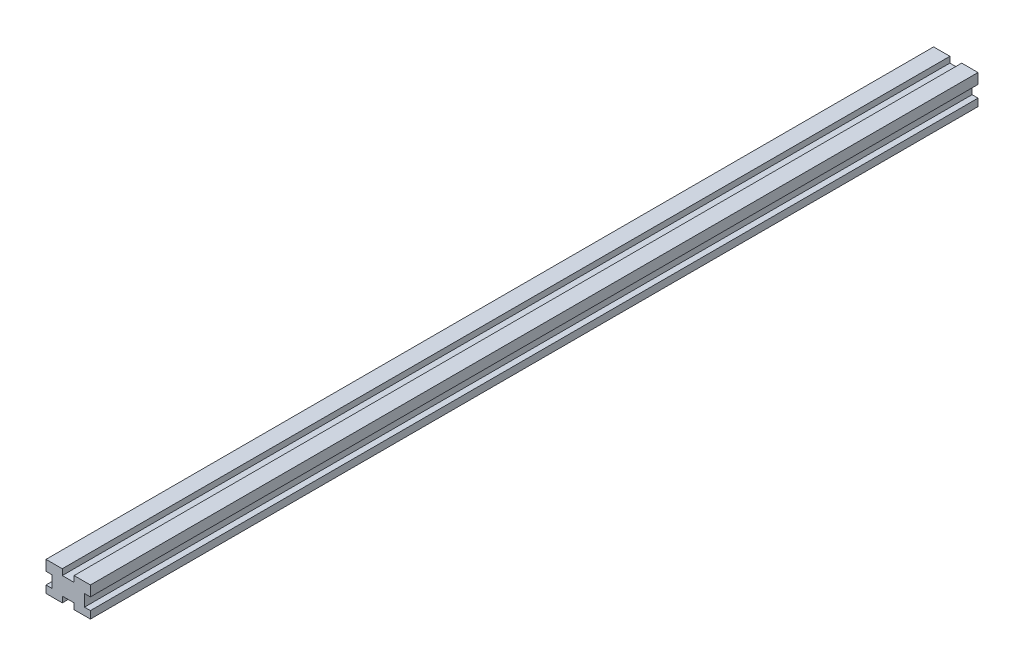
ISO-10303-21;
HEADER;
FILE_DESCRIPTION(('STEP AP214'),'2;1');
FILE_NAME('part.step','',(''),(''),'','','');
FILE_SCHEMA(('AUTOMOTIVE_DESIGN { 1 0 10303 214 1 1 1 1 }'));
ENDSEC;
DATA;
#1=APPLICATION_CONTEXT('core data for automotive mechanical design processes');
#2=APPLICATION_PROTOCOL_DEFINITION('international standard','automotive_design',2000,#1);
#3=PRODUCT_CONTEXT('',#1,'mechanical');
#4=PRODUCT('Part','Part','',(#3));
#5=PRODUCT_RELATED_PRODUCT_CATEGORY('part','',(#4));
#6=PRODUCT_DEFINITION_FORMATION('','',#4);
#7=PRODUCT_DEFINITION_CONTEXT('part definition',#1,'design');
#8=PRODUCT_DEFINITION('design','',#6,#7);
#9=PRODUCT_DEFINITION_SHAPE('','',#8);
#10=(LENGTH_UNIT() NAMED_UNIT(*) SI_UNIT(.MILLI.,.METRE.));
#11=(NAMED_UNIT(*) PLANE_ANGLE_UNIT() SI_UNIT($,.RADIAN.));
#12=(NAMED_UNIT(*) SI_UNIT($,.STERADIAN.) SOLID_ANGLE_UNIT());
#13=UNCERTAINTY_MEASURE_WITH_UNIT(LENGTH_MEASURE(1.E-05),#10,'distance_accuracy_value','');
#14=(GEOMETRIC_REPRESENTATION_CONTEXT(3) GLOBAL_UNCERTAINTY_ASSIGNED_CONTEXT((#13)) GLOBAL_UNIT_ASSIGNED_CONTEXT((#10,
#11,#12)) REPRESENTATION_CONTEXT('',''));
#15=CARTESIAN_POINT('',(0.,0.,0.));
#16=DIRECTION('',(0.,0.,1.));
#17=DIRECTION('',(1.,0.,0.));
#18=AXIS2_PLACEMENT_3D('',#15,#16,#17);
#19=CARTESIAN_POINT('',(7.5,-5.,300.));
#20=DIRECTION('',(-1.,0.,0.));
#21=DIRECTION('',(0.,-1.,0.));
#22=AXIS2_PLACEMENT_3D('',#19,#20,#21);
#23=PLANE('',#22);
#24=DIRECTION('',(0.,1.,0.));
#25=VECTOR('',#24,1.);
#26=CARTESIAN_POINT('',(7.5,-5.,0.));
#27=LINE('',#26,#25);
#28=CARTESIAN_POINT('',(7.5,-5.,0.));
#29=VERTEX_POINT('',#28);
#30=CARTESIAN_POINT('',(7.5,-2.5,0.));
#31=VERTEX_POINT('',#30);
#32=EDGE_CURVE('E197',#29,#31,#27,.T.);
#33=ORIENTED_EDGE('',*,*,#32,.T.);
#34=DIRECTION('',(0.,0.,1.));
#35=VECTOR('',#34,1.);
#36=CARTESIAN_POINT('',(7.5,-2.5,0.));
#37=LINE('',#36,#35);
#38=CARTESIAN_POINT('',(7.5,-2.5,300.));
#39=VERTEX_POINT('',#38);
#40=EDGE_CURVE('E277',#31,#39,#37,.T.);
#41=ORIENTED_EDGE('',*,*,#40,.T.);
#42=DIRECTION('',(0.,1.,0.));
#43=VECTOR('',#42,1.);
#44=CARTESIAN_POINT('',(7.5,-5.,300.));
#45=LINE('',#44,#43);
#46=CARTESIAN_POINT('',(7.5,-5.,300.));
#47=VERTEX_POINT('',#46);
#48=EDGE_CURVE('E286',#47,#39,#45,.T.);
#49=ORIENTED_EDGE('',*,*,#48,.F.);
#50=DIRECTION('',(0.,0.,-1.));
#51=VECTOR('',#50,1.);
#52=CARTESIAN_POINT('',(7.5,-5.,300.));
#53=LINE('',#52,#51);
#54=EDGE_CURVE('E217',#47,#29,#53,.T.);
#55=ORIENTED_EDGE('',*,*,#54,.T.);
#56=EDGE_LOOP('',(#33,#41,#49,#55));
#57=FACE_BOUND('',#56,.T.);
#58=ADVANCED_FACE('F37',(#57),#23,.F.);
#59=CARTESIAN_POINT('',(-7.5,-5.,300.));
#60=DIRECTION('',(1.,0.,0.));
#61=DIRECTION('',(0.,0.,-1.));
#62=AXIS2_PLACEMENT_3D('',#59,#60,#61);
#63=PLANE('',#62);
#64=DIRECTION('',(0.,-1.,0.));
#65=VECTOR('',#64,1.);
#66=CARTESIAN_POINT('',(-7.5,-5.,0.));
#67=LINE('',#66,#65);
#68=CARTESIAN_POINT('',(-7.5,5.,0.));
#69=VERTEX_POINT('',#68);
#70=CARTESIAN_POINT('',(-7.5,1.5,0.));
#71=VERTEX_POINT('',#70);
#72=EDGE_CURVE('E210',#69,#71,#67,.T.);
#73=ORIENTED_EDGE('',*,*,#72,.T.);
#74=DIRECTION('',(0.,0.,1.));
#75=VECTOR('',#74,1.);
#76=CARTESIAN_POINT('',(-7.5,1.5,0.));
#77=LINE('',#76,#75);
#78=CARTESIAN_POINT('',(-7.5,1.5,300.));
#79=VERTEX_POINT('',#78);
#80=EDGE_CURVE('E258',#71,#79,#77,.T.);
#81=ORIENTED_EDGE('',*,*,#80,.T.);
#82=DIRECTION('',(0.,-1.,0.));
#83=VECTOR('',#82,1.);
#84=CARTESIAN_POINT('',(-7.5,-5.,300.));
#85=LINE('',#84,#83);
#86=CARTESIAN_POINT('',(-7.5,5.,300.));
#87=VERTEX_POINT('',#86);
#88=EDGE_CURVE('E230',#87,#79,#85,.T.);
#89=ORIENTED_EDGE('',*,*,#88,.F.);
#90=DIRECTION('',(0.,0.,-1.));
#91=VECTOR('',#90,1.);
#92=CARTESIAN_POINT('',(-7.5,5.,300.));
#93=LINE('',#92,#91);
#94=EDGE_CURVE('E45',#87,#69,#93,.T.);
#95=ORIENTED_EDGE('',*,*,#94,.T.);
#96=EDGE_LOOP('',(#73,#81,#89,#95));
#97=FACE_BOUND('',#96,.T.);
#98=ADVANCED_FACE('F227',(#97),#63,.F.);
#99=CARTESIAN_POINT('',(-7.5,-5.,300.));
#100=DIRECTION('',(0.,1.,0.));
#101=DIRECTION('',(0.,0.,1.));
#102=AXIS2_PLACEMENT_3D('',#99,#100,#101);
#103=PLANE('',#102);
#104=DIRECTION('',(1.,0.,0.));
#105=VECTOR('',#104,1.);
#106=CARTESIAN_POINT('',(-7.5,-5.,300.));
#107=LINE('',#106,#105);
#108=CARTESIAN_POINT('',(2.,-5.,300.));
#109=VERTEX_POINT('',#108);
#110=EDGE_CURVE('E293',#109,#47,#107,.T.);
#111=ORIENTED_EDGE('',*,*,#110,.F.);
#112=DIRECTION('',(0.,0.,1.));
#113=VECTOR('',#112,1.);
#114=CARTESIAN_POINT('',(2.,-5.,0.));
#115=LINE('',#114,#113);
#116=CARTESIAN_POINT('',(2.,-5.,0.));
#117=VERTEX_POINT('',#116);
#118=EDGE_CURVE('E313',#117,#109,#115,.T.);
#119=ORIENTED_EDGE('',*,*,#118,.F.);
#120=DIRECTION('',(1.,0.,0.));
#121=VECTOR('',#120,1.);
#122=CARTESIAN_POINT('',(-7.5,-5.,0.));
#123=LINE('',#122,#121);
#124=EDGE_CURVE('E213',#117,#29,#123,.T.);
#125=ORIENTED_EDGE('',*,*,#124,.T.);
#126=ORIENTED_EDGE('',*,*,#54,.F.);
#127=EDGE_LOOP('',(#111,#119,#125,#126));
#128=FACE_BOUND('',#127,.T.);
#129=ADVANCED_FACE('F345',(#128),#103,.F.);
#130=CARTESIAN_POINT('',(-7.5,5.,300.));
#131=DIRECTION('',(0.,-1.,0.));
#132=DIRECTION('',(0.,0.,-1.));
#133=AXIS2_PLACEMENT_3D('',#130,#131,#132);
#134=PLANE('',#133);
#135=DIRECTION('',(-1.,0.,0.));
#136=VECTOR('',#135,1.);
#137=CARTESIAN_POINT('',(-7.5,5.,300.));
#138=LINE('',#137,#136);
#139=CARTESIAN_POINT('',(-2.,5.,300.));
#140=VERTEX_POINT('',#139);
#141=EDGE_CURVE('E289',#140,#87,#138,.T.);
#142=ORIENTED_EDGE('',*,*,#141,.F.);
#143=DIRECTION('',(0.,0.,1.));
#144=VECTOR('',#143,1.);
#145=CARTESIAN_POINT('',(-2.,5.,0.));
#146=LINE('',#145,#144);
#147=CARTESIAN_POINT('',(-2.,5.,0.));
#148=VERTEX_POINT('',#147);
#149=EDGE_CURVE('E198',#148,#140,#146,.T.);
#150=ORIENTED_EDGE('',*,*,#149,.F.);
#151=DIRECTION('',(-1.,0.,0.));
#152=VECTOR('',#151,1.);
#153=CARTESIAN_POINT('',(-7.5,5.,0.));
#154=LINE('',#153,#152);
#155=EDGE_CURVE('E201',#148,#69,#154,.T.);
#156=ORIENTED_EDGE('',*,*,#155,.T.);
#157=ORIENTED_EDGE('',*,*,#94,.F.);
#158=EDGE_LOOP('',(#142,#150,#156,#157));
#159=FACE_BOUND('',#158,.T.);
#160=ADVANCED_FACE('F349',(#159),#134,.F.);
#161=CARTESIAN_POINT('',(7.5,1.5,300.));
#162=VERTEX_POINT('',#161);
#163=CARTESIAN_POINT('',(7.5,5.,300.));
#164=VERTEX_POINT('',#163);
#165=EDGE_CURVE('E189',#162,#164,#45,.T.);
#166=ORIENTED_EDGE('',*,*,#165,.F.);
#167=DIRECTION('',(0.,0.,1.));
#168=VECTOR('',#167,1.);
#169=CARTESIAN_POINT('',(7.5,1.5,0.));
#170=LINE('',#169,#168);
#171=CARTESIAN_POINT('',(7.5,1.5,0.));
#172=VERTEX_POINT('',#171);
#173=EDGE_CURVE('E177',#172,#162,#170,.T.);
#174=ORIENTED_EDGE('',*,*,#173,.F.);
#175=CARTESIAN_POINT('',(7.5,5.,0.));
#176=VERTEX_POINT('',#175);
#177=EDGE_CURVE('E187',#172,#176,#27,.T.);
#178=ORIENTED_EDGE('',*,*,#177,.T.);
#179=DIRECTION('',(0.,0.,-1.));
#180=VECTOR('',#179,1.);
#181=CARTESIAN_POINT('',(7.5,5.,300.));
#182=LINE('',#181,#180);
#183=EDGE_CURVE('E11',#164,#176,#182,.T.);
#184=ORIENTED_EDGE('',*,*,#183,.F.);
#185=EDGE_LOOP('',(#166,#174,#178,#184));
#186=FACE_BOUND('',#185,.T.);
#187=ADVANCED_FACE('F39',(#186),#23,.F.);
#188=CARTESIAN_POINT('',(2.,5.,0.));
#189=VERTEX_POINT('',#188);
#190=EDGE_CURVE('E196',#176,#189,#154,.T.);
#191=ORIENTED_EDGE('',*,*,#190,.T.);
#192=DIRECTION('',(0.,0.,1.));
#193=VECTOR('',#192,1.);
#194=CARTESIAN_POINT('',(2.,5.,0.));
#195=LINE('',#194,#193);
#196=CARTESIAN_POINT('',(2.,5.,300.));
#197=VERTEX_POINT('',#196);
#198=EDGE_CURVE('E202',#189,#197,#195,.T.);
#199=ORIENTED_EDGE('',*,*,#198,.T.);
#200=EDGE_CURVE('E290',#164,#197,#138,.T.);
#201=ORIENTED_EDGE('',*,*,#200,.F.);
#202=ORIENTED_EDGE('',*,*,#183,.T.);
#203=EDGE_LOOP('',(#191,#199,#201,#202));
#204=FACE_BOUND('',#203,.T.);
#205=ADVANCED_FACE('F348',(#204),#134,.F.);
#206=CARTESIAN_POINT('',(-7.5,-2.5,300.));
#207=VERTEX_POINT('',#206);
#208=CARTESIAN_POINT('',(-7.5,-5.,300.));
#209=VERTEX_POINT('',#208);
#210=EDGE_CURVE('E292',#207,#209,#85,.T.);
#211=ORIENTED_EDGE('',*,*,#210,.F.);
#212=DIRECTION('',(0.,0.,1.));
#213=VECTOR('',#212,1.);
#214=CARTESIAN_POINT('',(-7.5,-2.5,0.));
#215=LINE('',#214,#213);
#216=CARTESIAN_POINT('',(-7.5,-2.5,0.));
#217=VERTEX_POINT('',#216);
#218=EDGE_CURVE('E242',#217,#207,#215,.T.);
#219=ORIENTED_EDGE('',*,*,#218,.F.);
#220=CARTESIAN_POINT('',(-7.5,-5.,0.));
#221=VERTEX_POINT('',#220);
#222=EDGE_CURVE('E209',#217,#221,#67,.T.);
#223=ORIENTED_EDGE('',*,*,#222,.T.);
#224=DIRECTION('',(0.,0.,-1.));
#225=VECTOR('',#224,1.);
#226=CARTESIAN_POINT('',(-7.5,-5.,300.));
#227=LINE('',#226,#225);
#228=EDGE_CURVE('E220',#209,#221,#227,.T.);
#229=ORIENTED_EDGE('',*,*,#228,.F.);
#230=EDGE_LOOP('',(#211,#219,#223,#229));
#231=FACE_BOUND('',#230,.T.);
#232=ADVANCED_FACE('F306',(#231),#63,.F.);
#233=CARTESIAN_POINT('',(-2.,-5.,0.));
#234=VERTEX_POINT('',#233);
#235=EDGE_CURVE('E214',#221,#234,#123,.T.);
#236=ORIENTED_EDGE('',*,*,#235,.T.);
#237=DIRECTION('',(0.,0.,1.));
#238=VECTOR('',#237,1.);
#239=CARTESIAN_POINT('',(-2.,-5.,0.));
#240=LINE('',#239,#238);
#241=CARTESIAN_POINT('',(-2.,-5.,300.));
#242=VERTEX_POINT('',#241);
#243=EDGE_CURVE('E312',#234,#242,#240,.T.);
#244=ORIENTED_EDGE('',*,*,#243,.T.);
#245=EDGE_CURVE('E206',#209,#242,#107,.T.);
#246=ORIENTED_EDGE('',*,*,#245,.F.);
#247=ORIENTED_EDGE('',*,*,#228,.T.);
#248=EDGE_LOOP('',(#236,#244,#246,#247));
#249=FACE_BOUND('',#248,.T.);
#250=ADVANCED_FACE('F311',(#249),#103,.F.);
#251=CARTESIAN_POINT('',(0.,0.,300.));
#252=DIRECTION('',(0.,0.,-1.));
#253=DIRECTION('',(-1.,0.,0.));
#254=AXIS2_PLACEMENT_3D('',#251,#252,#253);
#255=PLANE('',#254);
#256=ORIENTED_EDGE('',*,*,#48,.T.);
#257=DIRECTION('',(1.,0.,0.));
#258=VECTOR('',#257,1.);
#259=CARTESIAN_POINT('',(7.5,-2.5,300.));
#260=LINE('',#259,#258);
#261=CARTESIAN_POINT('',(5.5,-2.5,300.));
#262=VERTEX_POINT('',#261);
#263=EDGE_CURVE('E182',#262,#39,#260,.T.);
#264=ORIENTED_EDGE('',*,*,#263,.F.);
#265=DIRECTION('',(0.,-1.,0.));
#266=VECTOR('',#265,1.);
#267=CARTESIAN_POINT('',(5.5,1.5,300.));
#268=LINE('',#267,#266);
#269=CARTESIAN_POINT('',(5.5,1.5,300.));
#270=VERTEX_POINT('',#269);
#271=EDGE_CURVE('E407',#270,#262,#268,.T.);
#272=ORIENTED_EDGE('',*,*,#271,.F.);
#273=DIRECTION('',(-1.,0.,0.));
#274=VECTOR('',#273,1.);
#275=CARTESIAN_POINT('',(7.5,1.5,300.));
#276=LINE('',#275,#274);
#277=EDGE_CURVE('E316',#162,#270,#276,.T.);
#278=ORIENTED_EDGE('',*,*,#277,.F.);
#279=ORIENTED_EDGE('',*,*,#165,.T.);
#280=ORIENTED_EDGE('',*,*,#200,.T.);
#281=DIRECTION('',(0.,1.,0.));
#282=VECTOR('',#281,1.);
#283=CARTESIAN_POINT('',(2.,5.,300.));
#284=LINE('',#283,#282);
#285=CARTESIAN_POINT('',(2.,3.,300.));
#286=VERTEX_POINT('',#285);
#287=EDGE_CURVE('E267',#286,#197,#284,.T.);
#288=ORIENTED_EDGE('',*,*,#287,.F.);
#289=DIRECTION('',(1.,0.,0.));
#290=VECTOR('',#289,1.);
#291=CARTESIAN_POINT('',(-2.,3.,300.));
#292=LINE('',#291,#290);
#293=CARTESIAN_POINT('',(-2.,3.,300.));
#294=VERTEX_POINT('',#293);
#295=EDGE_CURVE('E276',#294,#286,#292,.T.);
#296=ORIENTED_EDGE('',*,*,#295,.F.);
#297=DIRECTION('',(0.,-1.,0.));
#298=VECTOR('',#297,1.);
#299=CARTESIAN_POINT('',(-2.,5.,300.));
#300=LINE('',#299,#298);
#301=EDGE_CURVE('E273',#140,#294,#300,.T.);
#302=ORIENTED_EDGE('',*,*,#301,.F.);
#303=ORIENTED_EDGE('',*,*,#141,.T.);
#304=ORIENTED_EDGE('',*,*,#88,.T.);
#305=DIRECTION('',(-1.,0.,0.));
#306=VECTOR('',#305,1.);
#307=CARTESIAN_POINT('',(-7.5,1.5,300.));
#308=LINE('',#307,#306);
#309=CARTESIAN_POINT('',(-5.5,1.5,300.));
#310=VERTEX_POINT('',#309);
#311=EDGE_CURVE('E256',#310,#79,#308,.T.);
#312=ORIENTED_EDGE('',*,*,#311,.F.);
#313=DIRECTION('',(0.,1.,0.));
#314=VECTOR('',#313,1.);
#315=CARTESIAN_POINT('',(-5.5,-2.5,300.));
#316=LINE('',#315,#314);
#317=CARTESIAN_POINT('',(-5.5,-2.5,300.));
#318=VERTEX_POINT('',#317);
#319=EDGE_CURVE('E253',#318,#310,#316,.T.);
#320=ORIENTED_EDGE('',*,*,#319,.F.);
#321=DIRECTION('',(1.,0.,0.));
#322=VECTOR('',#321,1.);
#323=CARTESIAN_POINT('',(-7.5,-2.5,300.));
#324=LINE('',#323,#322);
#325=EDGE_CURVE('E250',#207,#318,#324,.T.);
#326=ORIENTED_EDGE('',*,*,#325,.F.);
#327=ORIENTED_EDGE('',*,*,#210,.T.);
#328=ORIENTED_EDGE('',*,*,#245,.T.);
#329=DIRECTION('',(0.,-1.,0.));
#330=VECTOR('',#329,1.);
#331=CARTESIAN_POINT('',(-2.,-5.,300.));
#332=LINE('',#331,#330);
#333=CARTESIAN_POINT('',(-2.,-3.,300.));
#334=VERTEX_POINT('',#333);
#335=EDGE_CURVE('E429',#334,#242,#332,.T.);
#336=ORIENTED_EDGE('',*,*,#335,.F.);
#337=DIRECTION('',(-1.,0.,0.));
#338=VECTOR('',#337,1.);
#339=CARTESIAN_POINT('',(2.,-3.,300.));
#340=LINE('',#339,#338);
#341=CARTESIAN_POINT('',(2.,-3.,300.));
#342=VERTEX_POINT('',#341);
#343=EDGE_CURVE('E434',#342,#334,#340,.T.);
#344=ORIENTED_EDGE('',*,*,#343,.F.);
#345=DIRECTION('',(0.,1.,0.));
#346=VECTOR('',#345,1.);
#347=CARTESIAN_POINT('',(2.,-5.,300.));
#348=LINE('',#347,#346);
#349=EDGE_CURVE('E260',#109,#342,#348,.T.);
#350=ORIENTED_EDGE('',*,*,#349,.F.);
#351=ORIENTED_EDGE('',*,*,#110,.T.);
#352=EDGE_LOOP('',(#256,#264,#272,#278,#279,#280,#288,#296,#302,#303,#304,#312,#320,#326,#327,
#328,#336,#344,#350,#351));
#353=FACE_BOUND('',#352,.T.);
#354=ADVANCED_FACE('F300',(#353),#255,.F.);
#355=CARTESIAN_POINT('',(0.,0.,0.));
#356=DIRECTION('',(0.,0.,-1.));
#357=DIRECTION('',(-1.,0.,0.));
#358=AXIS2_PLACEMENT_3D('',#355,#356,#357);
#359=PLANE('',#358);
#360=DIRECTION('',(1.,0.,0.));
#361=VECTOR('',#360,1.);
#362=CARTESIAN_POINT('',(7.5,-2.5,0.));
#363=LINE('',#362,#361);
#364=CARTESIAN_POINT('',(5.5,-2.5,0.));
#365=VERTEX_POINT('',#364);
#366=EDGE_CURVE('E190',#365,#31,#363,.T.);
#367=ORIENTED_EDGE('',*,*,#366,.T.);
#368=ORIENTED_EDGE('',*,*,#32,.F.);
#369=ORIENTED_EDGE('',*,*,#124,.F.);
#370=DIRECTION('',(0.,1.,0.));
#371=VECTOR('',#370,1.);
#372=CARTESIAN_POINT('',(2.,-5.,0.));
#373=LINE('',#372,#371);
#374=CARTESIAN_POINT('',(2.,-3.,0.));
#375=VERTEX_POINT('',#374);
#376=EDGE_CURVE('E426',#117,#375,#373,.T.);
#377=ORIENTED_EDGE('',*,*,#376,.T.);
#378=DIRECTION('',(-1.,0.,0.));
#379=VECTOR('',#378,1.);
#380=CARTESIAN_POINT('',(2.,-3.,0.));
#381=LINE('',#380,#379);
#382=CARTESIAN_POINT('',(-2.,-3.,0.));
#383=VERTEX_POINT('',#382);
#384=EDGE_CURVE('E428',#375,#383,#381,.T.);
#385=ORIENTED_EDGE('',*,*,#384,.T.);
#386=DIRECTION('',(0.,-1.,0.));
#387=VECTOR('',#386,1.);
#388=CARTESIAN_POINT('',(-2.,-5.,0.));
#389=LINE('',#388,#387);
#390=EDGE_CURVE('E60',#383,#234,#389,.T.);
#391=ORIENTED_EDGE('',*,*,#390,.T.);
#392=ORIENTED_EDGE('',*,*,#235,.F.);
#393=ORIENTED_EDGE('',*,*,#222,.F.);
#394=DIRECTION('',(1.,0.,0.));
#395=VECTOR('',#394,1.);
#396=CARTESIAN_POINT('',(-7.5,-2.5,0.));
#397=LINE('',#396,#395);
#398=CARTESIAN_POINT('',(-5.5,-2.5,0.));
#399=VERTEX_POINT('',#398);
#400=EDGE_CURVE('E246',#217,#399,#397,.T.);
#401=ORIENTED_EDGE('',*,*,#400,.T.);
#402=DIRECTION('',(0.,1.,0.));
#403=VECTOR('',#402,1.);
#404=CARTESIAN_POINT('',(-5.5,-2.5,0.));
#405=LINE('',#404,#403);
#406=CARTESIAN_POINT('',(-5.5,1.5,0.));
#407=VERTEX_POINT('',#406);
#408=EDGE_CURVE('E240',#399,#407,#405,.T.);
#409=ORIENTED_EDGE('',*,*,#408,.T.);
#410=DIRECTION('',(-1.,0.,0.));
#411=VECTOR('',#410,1.);
#412=CARTESIAN_POINT('',(-7.5,1.5,0.));
#413=LINE('',#412,#411);
#414=EDGE_CURVE('E238',#407,#71,#413,.T.);
#415=ORIENTED_EDGE('',*,*,#414,.T.);
#416=ORIENTED_EDGE('',*,*,#72,.F.);
#417=ORIENTED_EDGE('',*,*,#155,.F.);
#418=DIRECTION('',(0.,-1.,0.));
#419=VECTOR('',#418,1.);
#420=CARTESIAN_POINT('',(-2.,5.,0.));
#421=LINE('',#420,#419);
#422=CARTESIAN_POINT('',(-2.,3.,0.));
#423=VERTEX_POINT('',#422);
#424=EDGE_CURVE('E264',#148,#423,#421,.T.);
#425=ORIENTED_EDGE('',*,*,#424,.T.);
#426=DIRECTION('',(1.,0.,0.));
#427=VECTOR('',#426,1.);
#428=CARTESIAN_POINT('',(-2.,3.,0.));
#429=LINE('',#428,#427);
#430=CARTESIAN_POINT('',(2.,3.,0.));
#431=VERTEX_POINT('',#430);
#432=EDGE_CURVE('E266',#423,#431,#429,.T.);
#433=ORIENTED_EDGE('',*,*,#432,.T.);
#434=DIRECTION('',(0.,1.,0.));
#435=VECTOR('',#434,1.);
#436=CARTESIAN_POINT('',(2.,5.,0.));
#437=LINE('',#436,#435);
#438=EDGE_CURVE('E270',#431,#189,#437,.T.);
#439=ORIENTED_EDGE('',*,*,#438,.T.);
#440=ORIENTED_EDGE('',*,*,#190,.F.);
#441=ORIENTED_EDGE('',*,*,#177,.F.);
#442=DIRECTION('',(-1.,0.,0.));
#443=VECTOR('',#442,1.);
#444=CARTESIAN_POINT('',(7.5,1.5,0.));
#445=LINE('',#444,#443);
#446=CARTESIAN_POINT('',(5.5,1.5,0.));
#447=VERTEX_POINT('',#446);
#448=EDGE_CURVE('E173',#172,#447,#445,.T.);
#449=ORIENTED_EDGE('',*,*,#448,.T.);
#450=DIRECTION('',(0.,-1.,0.));
#451=VECTOR('',#450,1.);
#452=CARTESIAN_POINT('',(5.5,1.5,0.));
#453=LINE('',#452,#451);
#454=EDGE_CURVE('E52',#447,#365,#453,.T.);
#455=ORIENTED_EDGE('',*,*,#454,.T.);
#456=EDGE_LOOP('',(#367,#368,#369,#377,#385,#391,#392,#393,#401,#409,#415,#416,#417,#425,#433,
#439,#440,#441,#449,#455));
#457=FACE_BOUND('',#456,.T.);
#458=ADVANCED_FACE('F193',(#457),#359,.T.);
#459=CARTESIAN_POINT('',(-2.,5.,0.));
#460=DIRECTION('',(-1.,0.,0.));
#461=DIRECTION('',(0.,-1.,0.));
#462=AXIS2_PLACEMENT_3D('',#459,#460,#461);
#463=PLANE('',#462);
#464=ORIENTED_EDGE('',*,*,#301,.T.);
#465=DIRECTION('',(0.,0.,1.));
#466=VECTOR('',#465,1.);
#467=CARTESIAN_POINT('',(-2.,3.,0.));
#468=LINE('',#467,#466);
#469=EDGE_CURVE('E272',#423,#294,#468,.T.);
#470=ORIENTED_EDGE('',*,*,#469,.F.);
#471=ORIENTED_EDGE('',*,*,#424,.F.);
#472=ORIENTED_EDGE('',*,*,#149,.T.);
#473=EDGE_LOOP('',(#464,#470,#471,#472));
#474=FACE_BOUND('',#473,.T.);
#475=ADVANCED_FACE('F365',(#474),#463,.F.);
#476=CARTESIAN_POINT('',(2.,5.,0.));
#477=DIRECTION('',(1.,0.,0.));
#478=DIRECTION('',(0.,1.,0.));
#479=AXIS2_PLACEMENT_3D('',#476,#477,#478);
#480=PLANE('',#479);
#481=ORIENTED_EDGE('',*,*,#287,.T.);
#482=ORIENTED_EDGE('',*,*,#198,.F.);
#483=ORIENTED_EDGE('',*,*,#438,.F.);
#484=DIRECTION('',(0.,0.,1.));
#485=VECTOR('',#484,1.);
#486=CARTESIAN_POINT('',(2.,3.,0.));
#487=LINE('',#486,#485);
#488=EDGE_CURVE('E283',#431,#286,#487,.T.);
#489=ORIENTED_EDGE('',*,*,#488,.T.);
#490=EDGE_LOOP('',(#481,#482,#483,#489));
#491=FACE_BOUND('',#490,.T.);
#492=ADVANCED_FACE('F336',(#491),#480,.F.);
#493=CARTESIAN_POINT('',(-2.,3.,0.));
#494=DIRECTION('',(0.,-1.,0.));
#495=DIRECTION('',(0.,0.,-1.));
#496=AXIS2_PLACEMENT_3D('',#493,#494,#495);
#497=PLANE('',#496);
#498=ORIENTED_EDGE('',*,*,#295,.T.);
#499=ORIENTED_EDGE('',*,*,#488,.F.);
#500=ORIENTED_EDGE('',*,*,#432,.F.);
#501=ORIENTED_EDGE('',*,*,#469,.T.);
#502=EDGE_LOOP('',(#498,#499,#500,#501));
#503=FACE_BOUND('',#502,.T.);
#504=ADVANCED_FACE('F329',(#503),#497,.F.);
#505=CARTESIAN_POINT('',(-7.5,1.5,0.));
#506=DIRECTION('',(0.,1.,0.));
#507=DIRECTION('',(0.,0.,1.));
#508=AXIS2_PLACEMENT_3D('',#505,#506,#507);
#509=PLANE('',#508);
#510=ORIENTED_EDGE('',*,*,#311,.T.);
#511=ORIENTED_EDGE('',*,*,#80,.F.);
#512=ORIENTED_EDGE('',*,*,#414,.F.);
#513=DIRECTION('',(0.,0.,1.));
#514=VECTOR('',#513,1.);
#515=CARTESIAN_POINT('',(-5.5,1.5,0.));
#516=LINE('',#515,#514);
#517=EDGE_CURVE('E261',#407,#310,#516,.T.);
#518=ORIENTED_EDGE('',*,*,#517,.T.);
#519=EDGE_LOOP('',(#510,#511,#512,#518));
#520=FACE_BOUND('',#519,.T.);
#521=ADVANCED_FACE('F327',(#520),#509,.F.);
#522=CARTESIAN_POINT('',(-5.5,-2.5,0.));
#523=DIRECTION('',(1.,0.,0.));
#524=DIRECTION('',(0.,0.,-1.));
#525=AXIS2_PLACEMENT_3D('',#522,#523,#524);
#526=PLANE('',#525);
#527=ORIENTED_EDGE('',*,*,#319,.T.);
#528=ORIENTED_EDGE('',*,*,#517,.F.);
#529=ORIENTED_EDGE('',*,*,#408,.F.);
#530=DIRECTION('',(0.,0.,1.));
#531=VECTOR('',#530,1.);
#532=CARTESIAN_POINT('',(-5.5,-2.5,0.));
#533=LINE('',#532,#531);
#534=EDGE_CURVE('E244',#399,#318,#533,.T.);
#535=ORIENTED_EDGE('',*,*,#534,.T.);
#536=EDGE_LOOP('',(#527,#528,#529,#535));
#537=FACE_BOUND('',#536,.T.);
#538=ADVANCED_FACE('F326',(#537),#526,.F.);
#539=CARTESIAN_POINT('',(-7.5,-2.5,0.));
#540=DIRECTION('',(0.,-1.,0.));
#541=DIRECTION('',(0.,0.,-1.));
#542=AXIS2_PLACEMENT_3D('',#539,#540,#541);
#543=PLANE('',#542);
#544=ORIENTED_EDGE('',*,*,#325,.T.);
#545=ORIENTED_EDGE('',*,*,#534,.F.);
#546=ORIENTED_EDGE('',*,*,#400,.F.);
#547=ORIENTED_EDGE('',*,*,#218,.T.);
#548=EDGE_LOOP('',(#544,#545,#546,#547));
#549=FACE_BOUND('',#548,.T.);
#550=ADVANCED_FACE('F324',(#549),#543,.F.);
#551=CARTESIAN_POINT('',(2.,-5.,0.));
#552=DIRECTION('',(1.,0.,0.));
#553=DIRECTION('',(0.,1.,0.));
#554=AXIS2_PLACEMENT_3D('',#551,#552,#553);
#555=PLANE('',#554);
#556=ORIENTED_EDGE('',*,*,#349,.T.);
#557=DIRECTION('',(0.,0.,1.));
#558=VECTOR('',#557,1.);
#559=CARTESIAN_POINT('',(2.,-3.,0.));
#560=LINE('',#559,#558);
#561=EDGE_CURVE('E318',#375,#342,#560,.T.);
#562=ORIENTED_EDGE('',*,*,#561,.F.);
#563=ORIENTED_EDGE('',*,*,#376,.F.);
#564=ORIENTED_EDGE('',*,*,#118,.T.);
#565=EDGE_LOOP('',(#556,#562,#563,#564));
#566=FACE_BOUND('',#565,.T.);
#567=ADVANCED_FACE('F375',(#566),#555,.F.);
#568=CARTESIAN_POINT('',(-2.,-5.,0.));
#569=DIRECTION('',(-1.,0.,0.));
#570=DIRECTION('',(0.,-1.,0.));
#571=AXIS2_PLACEMENT_3D('',#568,#569,#570);
#572=PLANE('',#571);
#573=ORIENTED_EDGE('',*,*,#335,.T.);
#574=ORIENTED_EDGE('',*,*,#243,.F.);
#575=ORIENTED_EDGE('',*,*,#390,.F.);
#576=DIRECTION('',(0.,0.,1.));
#577=VECTOR('',#576,1.);
#578=CARTESIAN_POINT('',(-2.,-3.,0.));
#579=LINE('',#578,#577);
#580=EDGE_CURVE('E314',#383,#334,#579,.T.);
#581=ORIENTED_EDGE('',*,*,#580,.T.);
#582=EDGE_LOOP('',(#573,#574,#575,#581));
#583=FACE_BOUND('',#582,.T.);
#584=ADVANCED_FACE('F379',(#583),#572,.F.);
#585=CARTESIAN_POINT('',(2.,-3.,0.));
#586=DIRECTION('',(0.,1.,0.));
#587=DIRECTION('',(0.,0.,1.));
#588=AXIS2_PLACEMENT_3D('',#585,#586,#587);
#589=PLANE('',#588);
#590=ORIENTED_EDGE('',*,*,#343,.T.);
#591=ORIENTED_EDGE('',*,*,#580,.F.);
#592=ORIENTED_EDGE('',*,*,#384,.F.);
#593=ORIENTED_EDGE('',*,*,#561,.T.);
#594=EDGE_LOOP('',(#590,#591,#592,#593));
#595=FACE_BOUND('',#594,.T.);
#596=ADVANCED_FACE('F384',(#595),#589,.F.);
#597=CARTESIAN_POINT('',(7.5,-2.5,0.));
#598=DIRECTION('',(0.,-1.,0.));
#599=DIRECTION('',(1.,0.,0.));
#600=AXIS2_PLACEMENT_3D('',#597,#598,#599);
#601=PLANE('',#600);
#602=ORIENTED_EDGE('',*,*,#263,.T.);
#603=ORIENTED_EDGE('',*,*,#40,.F.);
#604=ORIENTED_EDGE('',*,*,#366,.F.);
#605=DIRECTION('',(0.,0.,1.));
#606=VECTOR('',#605,1.);
#607=CARTESIAN_POINT('',(5.5,-2.5,0.));
#608=LINE('',#607,#606);
#609=EDGE_CURVE('E404',#365,#262,#608,.T.);
#610=ORIENTED_EDGE('',*,*,#609,.T.);
#611=EDGE_LOOP('',(#602,#603,#604,#610));
#612=FACE_BOUND('',#611,.T.);
#613=ADVANCED_FACE('F389',(#612),#601,.F.);
#614=CARTESIAN_POINT('',(5.5,1.5,0.));
#615=DIRECTION('',(-1.,0.,0.));
#616=DIRECTION('',(0.,0.,1.));
#617=AXIS2_PLACEMENT_3D('',#614,#615,#616);
#618=PLANE('',#617);
#619=ORIENTED_EDGE('',*,*,#271,.T.);
#620=ORIENTED_EDGE('',*,*,#609,.F.);
#621=ORIENTED_EDGE('',*,*,#454,.F.);
#622=DIRECTION('',(0.,0.,1.));
#623=VECTOR('',#622,1.);
#624=CARTESIAN_POINT('',(5.5,1.5,0.));
#625=LINE('',#624,#623);
#626=EDGE_CURVE('E179',#447,#270,#625,.T.);
#627=ORIENTED_EDGE('',*,*,#626,.T.);
#628=EDGE_LOOP('',(#619,#620,#621,#627));
#629=FACE_BOUND('',#628,.T.);
#630=ADVANCED_FACE('F394',(#629),#618,.F.);
#631=CARTESIAN_POINT('',(7.5,1.5,0.));
#632=DIRECTION('',(0.,1.,0.));
#633=DIRECTION('',(-1.,0.,0.));
#634=AXIS2_PLACEMENT_3D('',#631,#632,#633);
#635=PLANE('',#634);
#636=ORIENTED_EDGE('',*,*,#277,.T.);
#637=ORIENTED_EDGE('',*,*,#626,.F.);
#638=ORIENTED_EDGE('',*,*,#448,.F.);
#639=ORIENTED_EDGE('',*,*,#173,.T.);
#640=EDGE_LOOP('',(#636,#637,#638,#639));
#641=FACE_BOUND('',#640,.T.);
#642=ADVANCED_FACE('F176',(#641),#635,.F.);
#643=CLOSED_SHELL('',(#58,#98,#129,#160,#187,#205,#232,#250,#354,#458,#475,#492,#504,#521,#538,
#550,#567,#584,#596,#613,#630,#642));
#644=MANIFOLD_SOLID_BREP('B2',#643);
#645=ADVANCED_BREP_SHAPE_REPRESENTATION('',(#18,#644),#14);
#646=SHAPE_DEFINITION_REPRESENTATION(#9,#645);
ENDSEC;
END-ISO-10303-21;
